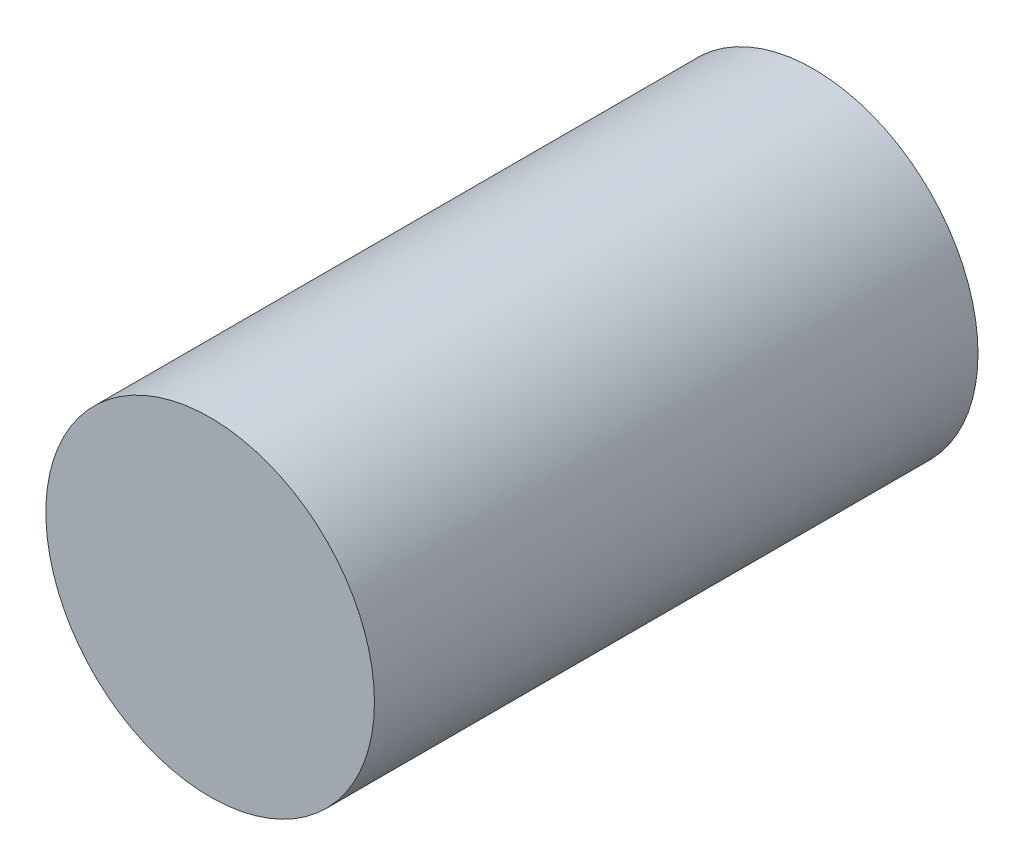
ISO-10303-21;
HEADER;
FILE_DESCRIPTION(('STEP AP214'),'2;1');
FILE_NAME('part.step','',(''),(''),'','','');
FILE_SCHEMA(('AUTOMOTIVE_DESIGN { 1 0 10303 214 1 1 1 1 }'));
ENDSEC;
DATA;
#1=APPLICATION_CONTEXT('core data for automotive mechanical design processes');
#2=APPLICATION_PROTOCOL_DEFINITION('international standard','automotive_design',2000,#1);
#3=PRODUCT_CONTEXT('',#1,'mechanical');
#4=PRODUCT('Part','Part','',(#3));
#5=PRODUCT_RELATED_PRODUCT_CATEGORY('part','',(#4));
#6=PRODUCT_DEFINITION_FORMATION('','',#4);
#7=PRODUCT_DEFINITION_CONTEXT('part definition',#1,'design');
#8=PRODUCT_DEFINITION('design','',#6,#7);
#9=PRODUCT_DEFINITION_SHAPE('','',#8);
#10=(LENGTH_UNIT() NAMED_UNIT(*) SI_UNIT(.MILLI.,.METRE.));
#11=(NAMED_UNIT(*) PLANE_ANGLE_UNIT() SI_UNIT($,.RADIAN.));
#12=(NAMED_UNIT(*) SI_UNIT($,.STERADIAN.) SOLID_ANGLE_UNIT());
#13=UNCERTAINTY_MEASURE_WITH_UNIT(LENGTH_MEASURE(1.E-05),#10,'distance_accuracy_value','');
#14=(GEOMETRIC_REPRESENTATION_CONTEXT(3) GLOBAL_UNCERTAINTY_ASSIGNED_CONTEXT((#13)) GLOBAL_UNIT_ASSIGNED_CONTEXT((#10,
#11,#12)) REPRESENTATION_CONTEXT('',''));
#15=CARTESIAN_POINT('',(0.,0.,0.));
#16=DIRECTION('',(0.,0.,1.));
#17=DIRECTION('',(1.,0.,0.));
#18=AXIS2_PLACEMENT_3D('',#15,#16,#17);
#19=CARTESIAN_POINT('',(0.,0.,9.));
#20=DIRECTION('',(0.,0.,-1.));
#21=DIRECTION('',(-1.,0.,0.));
#22=AXIS2_PLACEMENT_3D('',#19,#20,#21);
#23=CYLINDRICAL_SURFACE('',#22,2.45);
#24=CARTESIAN_POINT('',(0.,0.,9.));
#25=DIRECTION('',(0.,0.,1.));
#26=DIRECTION('',(1.,0.,0.));
#27=AXIS2_PLACEMENT_3D('',#24,#25,#26);
#28=CIRCLE('',#27,2.45);
#29=CARTESIAN_POINT('',(2.45,0.,9.));
#30=VERTEX_POINT('',#29);
#31=EDGE_CURVE('E10',#30,#30,#28,.T.);
#32=ORIENTED_EDGE('',*,*,#31,.F.);
#33=EDGE_LOOP('',(#32));
#34=FACE_BOUND('',#33,.T.);
#35=CARTESIAN_POINT('',(0.,0.,0.));
#36=DIRECTION('',(0.,0.,1.));
#37=DIRECTION('',(1.,0.,0.));
#38=AXIS2_PLACEMENT_3D('',#35,#36,#37);
#39=CIRCLE('',#38,2.45);
#40=CARTESIAN_POINT('',(2.45,0.,0.));
#41=VERTEX_POINT('',#40);
#42=EDGE_CURVE('E34',#41,#41,#39,.T.);
#43=ORIENTED_EDGE('',*,*,#42,.T.);
#44=EDGE_LOOP('',(#43));
#45=FACE_BOUND('',#44,.T.);
#46=ADVANCED_FACE('F31',(#34,#45),#23,.T.);
#47=CARTESIAN_POINT('',(0.,0.,9.));
#48=DIRECTION('',(0.,0.,1.));
#49=DIRECTION('',(1.,0.,0.));
#50=AXIS2_PLACEMENT_3D('',#47,#48,#49);
#51=PLANE('',#50);
#52=ORIENTED_EDGE('',*,*,#31,.T.);
#53=EDGE_LOOP('',(#52));
#54=FACE_BOUND('',#53,.T.);
#55=ADVANCED_FACE('F46',(#54),#51,.T.);
#56=CARTESIAN_POINT('',(0.,0.,0.));
#57=DIRECTION('',(0.,0.,1.));
#58=DIRECTION('',(1.,0.,0.));
#59=AXIS2_PLACEMENT_3D('',#56,#57,#58);
#60=PLANE('',#59);
#61=ORIENTED_EDGE('',*,*,#42,.F.);
#62=EDGE_LOOP('',(#61));
#63=FACE_BOUND('',#62,.T.);
#64=ADVANCED_FACE('F44',(#63),#60,.F.);
#65=CLOSED_SHELL('',(#46,#55,#64));
#66=MANIFOLD_SOLID_BREP('B2',#65);
#67=ADVANCED_BREP_SHAPE_REPRESENTATION('',(#18,#66),#14);
#68=SHAPE_DEFINITION_REPRESENTATION(#9,#67);
ENDSEC;
END-ISO-10303-21;
